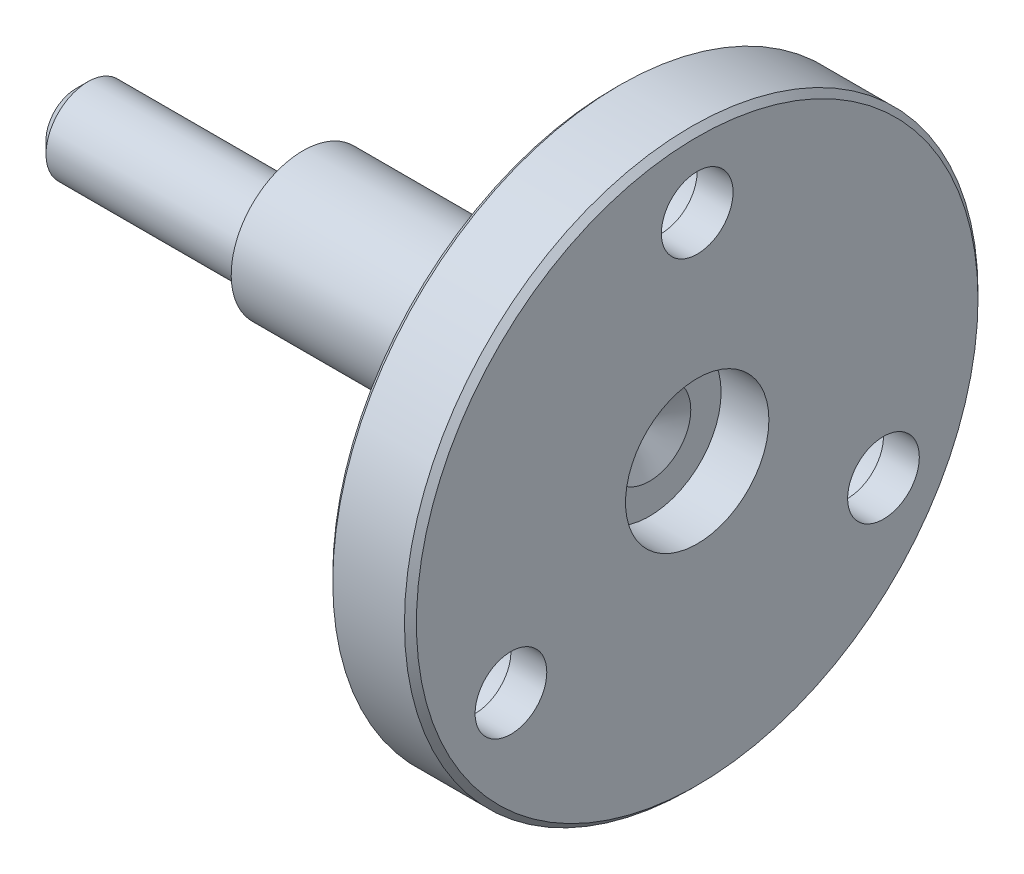
ISO-10303-21;
HEADER;
FILE_DESCRIPTION(('STEP AP214'),'2;1');
FILE_NAME('part.step','',(''),(''),'','','');
FILE_SCHEMA(('AUTOMOTIVE_DESIGN { 1 0 10303 214 1 1 1 1 }'));
ENDSEC;
DATA;
#1=APPLICATION_CONTEXT('core data for automotive mechanical design processes');
#2=APPLICATION_PROTOCOL_DEFINITION('international standard','automotive_design',2000,#1);
#3=PRODUCT_CONTEXT('',#1,'mechanical');
#4=PRODUCT('Part','Part','',(#3));
#5=PRODUCT_RELATED_PRODUCT_CATEGORY('part','',(#4));
#6=PRODUCT_DEFINITION_FORMATION('','',#4);
#7=PRODUCT_DEFINITION_CONTEXT('part definition',#1,'design');
#8=PRODUCT_DEFINITION('design','',#6,#7);
#9=PRODUCT_DEFINITION_SHAPE('','',#8);
#10=(LENGTH_UNIT() NAMED_UNIT(*) SI_UNIT(.MILLI.,.METRE.));
#11=(NAMED_UNIT(*) PLANE_ANGLE_UNIT() SI_UNIT($,.RADIAN.));
#12=(NAMED_UNIT(*) SI_UNIT($,.STERADIAN.) SOLID_ANGLE_UNIT());
#13=UNCERTAINTY_MEASURE_WITH_UNIT(LENGTH_MEASURE(1.E-05),#10,'distance_accuracy_value','');
#14=(GEOMETRIC_REPRESENTATION_CONTEXT(3) GLOBAL_UNCERTAINTY_ASSIGNED_CONTEXT((#13)) GLOBAL_UNIT_ASSIGNED_CONTEXT((#10,
#11,#12)) REPRESENTATION_CONTEXT('',''));
#15=CARTESIAN_POINT('',(0.,0.,0.));
#16=DIRECTION('',(0.,0.,1.));
#17=DIRECTION('',(1.,0.,0.));
#18=AXIS2_PLACEMENT_3D('',#15,#16,#17);
#19=CARTESIAN_POINT('',(-7.,11.,0.));
#20=DIRECTION('',(-1.,0.,0.));
#21=DIRECTION('',(0.,0.,1.));
#22=AXIS2_PLACEMENT_3D('',#19,#20,#21);
#23=PLANE('',#22);
#24=CARTESIAN_POINT('',(-7.,-9.00000000000008,-15.5884572681199));
#25=DIRECTION('',(-1.,0.,0.));
#26=DIRECTION('',(0.,0.,1.));
#27=AXIS2_PLACEMENT_3D('',#24,#25,#26);
#28=CIRCLE('',#27,5.00000000000001);
#29=CARTESIAN_POINT('',(-7.,-9.00000000000008,-10.5884572681198));
#30=VERTEX_POINT('',#29);
#31=EDGE_CURVE('E84',#30,#30,#28,.F.);
#32=ORIENTED_EDGE('',*,*,#31,.T.);
#33=EDGE_LOOP('',(#32));
#34=FACE_BOUND('',#33,.T.);
#35=CARTESIAN_POINT('',(-7.,0.,0.));
#36=DIRECTION('',(1.,0.,0.));
#37=DIRECTION('',(0.,0.,-1.));
#38=AXIS2_PLACEMENT_3D('',#35,#36,#37);
#39=CIRCLE('',#38,11.);
#40=CARTESIAN_POINT('',(-7.,0.,-11.));
#41=VERTEX_POINT('',#40);
#42=EDGE_CURVE('E129',#41,#41,#39,.T.);
#43=ORIENTED_EDGE('',*,*,#42,.T.);
#44=EDGE_LOOP('',(#43));
#45=FACE_BOUND('',#44,.T.);
#46=CARTESIAN_POINT('',(-7.,0.,0.));
#47=DIRECTION('',(-1.,0.,0.));
#48=DIRECTION('',(0.,0.,1.));
#49=AXIS2_PLACEMENT_3D('',#46,#47,#48);
#50=CIRCLE('',#49,23.5);
#51=CARTESIAN_POINT('',(-7.,0.,23.5));
#52=VERTEX_POINT('',#51);
#53=EDGE_CURVE('E45',#52,#52,#50,.T.);
#54=ORIENTED_EDGE('',*,*,#53,.T.);
#55=EDGE_LOOP('',(#54));
#56=FACE_BOUND('',#55,.T.);
#57=CARTESIAN_POINT('',(-7.,18.,0.));
#58=DIRECTION('',(-1.,0.,0.));
#59=DIRECTION('',(0.,0.,1.));
#60=AXIS2_PLACEMENT_3D('',#57,#58,#59);
#61=CIRCLE('',#60,5.00000000000001);
#62=CARTESIAN_POINT('',(-7.,18.,5.00000000000001));
#63=VERTEX_POINT('',#62);
#64=EDGE_CURVE('E76',#63,#63,#61,.F.);
#65=ORIENTED_EDGE('',*,*,#64,.T.);
#66=EDGE_LOOP('',(#65));
#67=FACE_BOUND('',#66,.T.);
#68=CARTESIAN_POINT('',(-7.,-8.99999999999986,15.58845726812));
#69=DIRECTION('',(-1.,0.,0.));
#70=DIRECTION('',(0.,0.,1.));
#71=AXIS2_PLACEMENT_3D('',#68,#69,#70);
#72=CIRCLE('',#71,5.00000000000001);
#73=CARTESIAN_POINT('',(-7.,-8.99999999999986,20.58845726812));
#74=VERTEX_POINT('',#73);
#75=EDGE_CURVE('E40',#74,#74,#72,.F.);
#76=ORIENTED_EDGE('',*,*,#75,.T.);
#77=EDGE_LOOP('',(#76));
#78=FACE_BOUND('',#77,.T.);
#79=ADVANCED_FACE('F36',(#34,#45,#56,#67,#78),#23,.T.);
#80=CARTESIAN_POINT('',(0.,24.,0.));
#81=DIRECTION('',(1.,0.,0.));
#82=DIRECTION('',(0.,0.,-1.));
#83=AXIS2_PLACEMENT_3D('',#80,#81,#82);
#84=PLANE('',#83);
#85=CARTESIAN_POINT('',(0.,-9.00000000000007,-15.5884572681199));
#86=DIRECTION('',(1.,0.,0.));
#87=DIRECTION('',(0.,0.,-1.));
#88=AXIS2_PLACEMENT_3D('',#85,#86,#87);
#89=CIRCLE('',#88,3.);
#90=CARTESIAN_POINT('',(0.,-9.00000000000007,-18.5884572681199));
#91=VERTEX_POINT('',#90);
#92=EDGE_CURVE('E81',#91,#91,#89,.F.);
#93=ORIENTED_EDGE('',*,*,#92,.T.);
#94=EDGE_LOOP('',(#93));
#95=FACE_BOUND('',#94,.T.);
#96=CARTESIAN_POINT('',(0.,0.,0.));
#97=DIRECTION('',(1.,0.,0.));
#98=DIRECTION('',(0.,0.,-1.));
#99=AXIS2_PLACEMENT_3D('',#96,#97,#98);
#100=CIRCLE('',#99,6.);
#101=CARTESIAN_POINT('',(0.,0.,-6.));
#102=VERTEX_POINT('',#101);
#103=EDGE_CURVE('E126',#102,#102,#100,.T.);
#104=ORIENTED_EDGE('',*,*,#103,.F.);
#105=EDGE_LOOP('',(#104));
#106=FACE_BOUND('',#105,.T.);
#107=CARTESIAN_POINT('',(0.,0.,0.));
#108=DIRECTION('',(1.,0.,0.));
#109=DIRECTION('',(0.,0.,-1.));
#110=AXIS2_PLACEMENT_3D('',#107,#108,#109);
#111=CIRCLE('',#110,23.5);
#112=CARTESIAN_POINT('',(0.,0.,-23.5));
#113=VERTEX_POINT('',#112);
#114=EDGE_CURVE('E12',#113,#113,#111,.T.);
#115=ORIENTED_EDGE('',*,*,#114,.T.);
#116=EDGE_LOOP('',(#115));
#117=FACE_BOUND('',#116,.T.);
#118=CARTESIAN_POINT('',(0.,18.,0.));
#119=DIRECTION('',(1.,0.,0.));
#120=DIRECTION('',(0.,0.,-1.));
#121=AXIS2_PLACEMENT_3D('',#118,#119,#120);
#122=CIRCLE('',#121,3.);
#123=CARTESIAN_POINT('',(0.,18.,-3.));
#124=VERTEX_POINT('',#123);
#125=EDGE_CURVE('E73',#124,#124,#122,.F.);
#126=ORIENTED_EDGE('',*,*,#125,.T.);
#127=EDGE_LOOP('',(#126));
#128=FACE_BOUND('',#127,.T.);
#129=CARTESIAN_POINT('',(0.,-8.99999999999985,15.58845726812));
#130=DIRECTION('',(1.,0.,0.));
#131=DIRECTION('',(0.,0.,-1.));
#132=AXIS2_PLACEMENT_3D('',#129,#130,#131);
#133=CIRCLE('',#132,3.);
#134=CARTESIAN_POINT('',(0.,-8.99999999999985,12.58845726812));
#135=VERTEX_POINT('',#134);
#136=EDGE_CURVE('E88',#135,#135,#133,.F.);
#137=ORIENTED_EDGE('',*,*,#136,.T.);
#138=EDGE_LOOP('',(#137));
#139=FACE_BOUND('',#138,.T.);
#140=ADVANCED_FACE('F152',(#95,#106,#117,#128,#139),#84,.T.);
#141=CARTESIAN_POINT('',(-33.,0.,0.));
#142=DIRECTION('',(-1.,0.,0.));
#143=DIRECTION('',(0.,0.,1.));
#144=AXIS2_PLACEMENT_3D('',#141,#142,#143);
#145=PLANE('',#144);
#146=CARTESIAN_POINT('',(-33.,0.,0.));
#147=DIRECTION('',(1.,0.,0.));
#148=DIRECTION('',(0.,0.,-1.));
#149=AXIS2_PLACEMENT_3D('',#146,#147,#148);
#150=CIRCLE('',#149,5.99999999999999);
#151=CARTESIAN_POINT('',(-33.,-6.00000000000005,0.));
#152=VERTEX_POINT('',#151);
#153=EDGE_CURVE('E54',#152,#152,#150,.T.);
#154=ORIENTED_EDGE('',*,*,#153,.F.);
#155=CARTESIAN_POINT('',(-33.,-1.5,0.));
#156=DIRECTION('',(1.,0.,0.));
#157=DIRECTION('',(0.,1.,0.));
#158=AXIS2_PLACEMENT_3D('',#155,#156,#157);
#159=CIRCLE('',#158,4.50000000000004);
#160=EDGE_CURVE('E56',#152,#152,#159,.T.);
#161=ORIENTED_EDGE('',*,*,#160,.T.);
#162=EDGE_LOOP('',(#154,#161));
#163=FACE_BOUND('',#162,.T.);
#164=ADVANCED_FACE('F38',(#163),#145,.T.);
#165=CARTESIAN_POINT('',(0.,0.,0.));
#166=DIRECTION('',(1.,0.,0.));
#167=DIRECTION('',(0.,0.,-1.));
#168=AXIS2_PLACEMENT_3D('',#165,#166,#167);
#169=CYLINDRICAL_SURFACE('',#168,5.99999999999999);
#170=ORIENTED_EDGE('',*,*,#153,.T.);
#171=EDGE_LOOP('',(#170));
#172=FACE_BOUND('',#171,.T.);
#173=CARTESIAN_POINT('',(-11.,0.,0.));
#174=DIRECTION('',(1.,0.,0.));
#175=DIRECTION('',(0.,0.,-1.));
#176=AXIS2_PLACEMENT_3D('',#173,#174,#175);
#177=CIRCLE('',#176,5.99999999999999);
#178=CARTESIAN_POINT('',(-11.,0.,-5.99999999999999));
#179=VERTEX_POINT('',#178);
#180=EDGE_CURVE('E59',#179,#179,#177,.T.);
#181=ORIENTED_EDGE('',*,*,#180,.F.);
#182=EDGE_LOOP('',(#181));
#183=FACE_BOUND('',#182,.T.);
#184=ADVANCED_FACE('F142',(#172,#183),#169,.T.);
#185=CARTESIAN_POINT('',(-11.,5.99999999999999,0.));
#186=DIRECTION('',(-1.,0.,0.));
#187=DIRECTION('',(0.,0.,1.));
#188=AXIS2_PLACEMENT_3D('',#185,#186,#187);
#189=PLANE('',#188);
#190=ORIENTED_EDGE('',*,*,#180,.T.);
#191=EDGE_LOOP('',(#190));
#192=FACE_BOUND('',#191,.T.);
#193=CARTESIAN_POINT('',(-11.,0.,0.));
#194=DIRECTION('',(1.,0.,0.));
#195=DIRECTION('',(0.,0.,-1.));
#196=AXIS2_PLACEMENT_3D('',#193,#194,#195);
#197=CIRCLE('',#196,8.);
#198=CARTESIAN_POINT('',(-11.,0.,-8.));
#199=VERTEX_POINT('',#198);
#200=EDGE_CURVE('E65',#199,#199,#197,.T.);
#201=ORIENTED_EDGE('',*,*,#200,.F.);
#202=EDGE_LOOP('',(#201));
#203=FACE_BOUND('',#202,.T.);
#204=ADVANCED_FACE('F140',(#192,#203),#189,.T.);
#205=CARTESIAN_POINT('',(0.,0.,0.));
#206=DIRECTION('',(1.,0.,0.));
#207=DIRECTION('',(0.,0.,-1.));
#208=AXIS2_PLACEMENT_3D('',#205,#206,#207);
#209=CYLINDRICAL_SURFACE('',#208,8.);
#210=ORIENTED_EDGE('',*,*,#200,.T.);
#211=EDGE_LOOP('',(#210));
#212=FACE_BOUND('',#211,.T.);
#213=CARTESIAN_POINT('',(-10.,0.,0.));
#214=DIRECTION('',(1.,0.,0.));
#215=DIRECTION('',(0.,0.,-1.));
#216=AXIS2_PLACEMENT_3D('',#213,#214,#215);
#217=CIRCLE('',#216,8.);
#218=CARTESIAN_POINT('',(-10.,0.,-8.));
#219=VERTEX_POINT('',#218);
#220=EDGE_CURVE('E132',#219,#219,#217,.T.);
#221=ORIENTED_EDGE('',*,*,#220,.F.);
#222=EDGE_LOOP('',(#221));
#223=FACE_BOUND('',#222,.T.);
#224=ADVANCED_FACE('F137',(#212,#223),#209,.T.);
#225=CARTESIAN_POINT('',(-10.,0.,0.));
#226=DIRECTION('',(1.,0.,0.));
#227=DIRECTION('',(0.,0.,-1.));
#228=AXIS2_PLACEMENT_3D('',#225,#226,#227);
#229=TOROIDAL_SURFACE('',#228,11.,3.);
#230=ORIENTED_EDGE('',*,*,#220,.T.);
#231=EDGE_LOOP('',(#230));
#232=FACE_BOUND('',#231,.T.);
#233=ORIENTED_EDGE('',*,*,#42,.F.);
#234=EDGE_LOOP('',(#233));
#235=FACE_BOUND('',#234,.T.);
#236=ADVANCED_FACE('F149',(#232,#235),#229,.F.);
#237=CARTESIAN_POINT('',(0.,0.,0.));
#238=DIRECTION('',(1.,0.,0.));
#239=DIRECTION('',(0.,0.,-1.));
#240=AXIS2_PLACEMENT_3D('',#237,#238,#239);
#241=CYLINDRICAL_SURFACE('',#240,24.);
#242=CARTESIAN_POINT('',(-6.5,0.,0.));
#243=DIRECTION('',(-1.,0.,0.));
#244=DIRECTION('',(0.,0.,1.));
#245=AXIS2_PLACEMENT_3D('',#242,#243,#244);
#246=CIRCLE('',#245,24.);
#247=CARTESIAN_POINT('',(-6.5,0.,24.));
#248=VERTEX_POINT('',#247);
#249=EDGE_CURVE('E62',#248,#248,#246,.F.);
#250=ORIENTED_EDGE('',*,*,#249,.T.);
#251=EDGE_LOOP('',(#250));
#252=FACE_BOUND('',#251,.T.);
#253=CARTESIAN_POINT('',(-0.5,0.,0.));
#254=DIRECTION('',(1.,0.,0.));
#255=DIRECTION('',(0.,0.,-1.));
#256=AXIS2_PLACEMENT_3D('',#253,#254,#255);
#257=CIRCLE('',#256,24.);
#258=CARTESIAN_POINT('',(-0.5,0.,-24.));
#259=VERTEX_POINT('',#258);
#260=EDGE_CURVE('E58',#259,#259,#257,.F.);
#261=ORIENTED_EDGE('',*,*,#260,.T.);
#262=EDGE_LOOP('',(#261));
#263=FACE_BOUND('',#262,.T.);
#264=ADVANCED_FACE('F163',(#252,#263),#241,.T.);
#265=CARTESIAN_POINT('',(0.,0.,0.));
#266=DIRECTION('',(1.,0.,0.));
#267=DIRECTION('',(0.,0.,-1.));
#268=AXIS2_PLACEMENT_3D('',#265,#266,#267);
#269=CYLINDRICAL_SURFACE('',#268,6.);
#270=ORIENTED_EDGE('',*,*,#103,.T.);
#271=EDGE_LOOP('',(#270));
#272=FACE_BOUND('',#271,.T.);
#273=CARTESIAN_POINT('',(-4.,0.,0.));
#274=DIRECTION('',(1.,0.,0.));
#275=DIRECTION('',(0.,0.,-1.));
#276=AXIS2_PLACEMENT_3D('',#273,#274,#275);
#277=CIRCLE('',#276,6.);
#278=CARTESIAN_POINT('',(-4.,0.,-6.));
#279=VERTEX_POINT('',#278);
#280=EDGE_CURVE('E123',#279,#279,#277,.T.);
#281=ORIENTED_EDGE('',*,*,#280,.F.);
#282=EDGE_LOOP('',(#281));
#283=FACE_BOUND('',#282,.T.);
#284=ADVANCED_FACE('F169',(#272,#283),#269,.F.);
#285=CARTESIAN_POINT('',(-4.,6.,0.));
#286=DIRECTION('',(1.,0.,0.));
#287=DIRECTION('',(0.,0.,-1.));
#288=AXIS2_PLACEMENT_3D('',#285,#286,#287);
#289=PLANE('',#288);
#290=ORIENTED_EDGE('',*,*,#280,.T.);
#291=EDGE_LOOP('',(#290));
#292=FACE_BOUND('',#291,.T.);
#293=CARTESIAN_POINT('',(-4.,0.,0.));
#294=DIRECTION('',(1.,0.,0.));
#295=DIRECTION('',(0.,0.,-1.));
#296=AXIS2_PLACEMENT_3D('',#293,#294,#295);
#297=CIRCLE('',#296,3.46410161513778);
#298=CARTESIAN_POINT('',(-4.,0.,-3.46410161513778));
#299=VERTEX_POINT('',#298);
#300=EDGE_CURVE('E120',#299,#299,#297,.T.);
#301=ORIENTED_EDGE('',*,*,#300,.F.);
#302=EDGE_LOOP('',(#301));
#303=FACE_BOUND('',#302,.T.);
#304=ADVANCED_FACE('F244',(#292,#303),#289,.T.);
#305=CARTESIAN_POINT('',(-6.,0.,0.));
#306=DIRECTION('',(1.,0.,0.));
#307=DIRECTION('',(0.,0.,-1.));
#308=AXIS2_PLACEMENT_3D('',#305,#306,#307);
#309=CONICAL_SURFACE('',#308,0.,1.0471975511966);
#310=ORIENTED_EDGE('',*,*,#300,.T.);
#311=EDGE_LOOP('',(#310));
#312=FACE_BOUND('',#311,.T.);
#313=CARTESIAN_POINT('',(-6.,0.,0.));
#314=VERTEX_POINT('',#313);
#315=VERTEX_LOOP('',#314);
#316=FACE_BOUND('',#315,.T.);
#317=ADVANCED_FACE('F240',(#312,#316),#309,.F.);
#318=CARTESIAN_POINT('',(-6.5,0.,0.));
#319=DIRECTION('',(1.,0.,0.));
#320=DIRECTION('',(0.,0.,-1.));
#321=AXIS2_PLACEMENT_3D('',#318,#319,#320);
#322=CONICAL_SURFACE('',#321,24.,0.785398163397452);
#323=ORIENTED_EDGE('',*,*,#53,.F.);
#324=EDGE_LOOP('',(#323));
#325=FACE_BOUND('',#324,.T.);
#326=ORIENTED_EDGE('',*,*,#249,.F.);
#327=EDGE_LOOP('',(#326));
#328=FACE_BOUND('',#327,.T.);
#329=ADVANCED_FACE('F236',(#325,#328),#322,.T.);
#330=CARTESIAN_POINT('',(0.,0.,0.));
#331=DIRECTION('',(-1.,0.,0.));
#332=DIRECTION('',(0.,0.,1.));
#333=AXIS2_PLACEMENT_3D('',#330,#331,#332);
#334=CONICAL_SURFACE('',#333,23.5,0.785398163397452);
#335=ORIENTED_EDGE('',*,*,#260,.F.);
#336=EDGE_LOOP('',(#335));
#337=FACE_BOUND('',#336,.T.);
#338=ORIENTED_EDGE('',*,*,#114,.F.);
#339=EDGE_LOOP('',(#338));
#340=FACE_BOUND('',#339,.T.);
#341=ADVANCED_FACE('F232',(#337,#340),#334,.T.);
#342=CARTESIAN_POINT('',(-33.,-1.5,0.));
#343=DIRECTION('',(1.,0.,0.));
#344=DIRECTION('',(0.,1.,0.));
#345=AXIS2_PLACEMENT_3D('',#342,#343,#344);
#346=CONICAL_SURFACE('',#345,4.50000000000004,0.785398163397451);
#347=CARTESIAN_POINT('',(-34.,-1.5,0.));
#348=DIRECTION('',(1.,0.,0.));
#349=DIRECTION('',(0.,1.,0.));
#350=AXIS2_PLACEMENT_3D('',#347,#348,#349);
#351=CIRCLE('',#350,3.5);
#352=CARTESIAN_POINT('',(-34.,2.,0.));
#353=VERTEX_POINT('',#352);
#354=EDGE_CURVE('E116',#353,#353,#351,.T.);
#355=ORIENTED_EDGE('',*,*,#354,.T.);
#356=EDGE_LOOP('',(#355));
#357=FACE_BOUND('',#356,.T.);
#358=ORIENTED_EDGE('',*,*,#160,.F.);
#359=EDGE_LOOP('',(#358));
#360=FACE_BOUND('',#359,.T.);
#361=ADVANCED_FACE('F228',(#357,#360),#346,.T.);
#362=CARTESIAN_POINT('',(-19.,-1.5,0.));
#363=DIRECTION('',(1.,0.,0.));
#364=DIRECTION('',(0.,1.,0.));
#365=AXIS2_PLACEMENT_3D('',#362,#363,#364);
#366=CYLINDRICAL_SURFACE('',#365,3.5);
#367=CARTESIAN_POINT('',(-51.,-1.50000000000001,0.));
#368=DIRECTION('',(1.,0.,0.));
#369=DIRECTION('',(0.,1.,0.));
#370=AXIS2_PLACEMENT_3D('',#367,#368,#369);
#371=CIRCLE('',#370,3.5);
#372=CARTESIAN_POINT('',(-51.,1.99999999999999,0.));
#373=VERTEX_POINT('',#372);
#374=EDGE_CURVE('E113',#373,#373,#371,.T.);
#375=ORIENTED_EDGE('',*,*,#374,.T.);
#376=EDGE_LOOP('',(#375));
#377=FACE_BOUND('',#376,.T.);
#378=ORIENTED_EDGE('',*,*,#354,.F.);
#379=EDGE_LOOP('',(#378));
#380=FACE_BOUND('',#379,.T.);
#381=ADVANCED_FACE('F224',(#377,#380),#366,.T.);
#382=CARTESIAN_POINT('',(-51.,-1.50000000000001,0.));
#383=DIRECTION('',(1.,0.,0.));
#384=DIRECTION('',(0.,1.,0.));
#385=AXIS2_PLACEMENT_3D('',#382,#383,#384);
#386=CONICAL_SURFACE('',#385,3.5,0.785398163397449);
#387=CARTESIAN_POINT('',(-52.,-1.50000000000001,0.));
#388=DIRECTION('',(1.,0.,0.));
#389=DIRECTION('',(0.,1.,0.));
#390=AXIS2_PLACEMENT_3D('',#387,#388,#389);
#391=CIRCLE('',#390,2.5);
#392=CARTESIAN_POINT('',(-52.,0.999999999999992,0.));
#393=VERTEX_POINT('',#392);
#394=EDGE_CURVE('E80',#393,#393,#391,.T.);
#395=ORIENTED_EDGE('',*,*,#394,.T.);
#396=EDGE_LOOP('',(#395));
#397=FACE_BOUND('',#396,.T.);
#398=ORIENTED_EDGE('',*,*,#374,.F.);
#399=EDGE_LOOP('',(#398));
#400=FACE_BOUND('',#399,.T.);
#401=ADVANCED_FACE('F220',(#397,#400),#386,.T.);
#402=CARTESIAN_POINT('',(-52.,0.999999999999992,0.));
#403=DIRECTION('',(-1.,0.,0.));
#404=DIRECTION('',(0.,-1.,0.));
#405=AXIS2_PLACEMENT_3D('',#402,#403,#404);
#406=PLANE('',#405);
#407=ORIENTED_EDGE('',*,*,#394,.F.);
#408=EDGE_LOOP('',(#407));
#409=FACE_BOUND('',#408,.T.);
#410=ADVANCED_FACE('F216',(#409),#406,.T.);
#411=CARTESIAN_POINT('',(-12.,18.,0.));
#412=DIRECTION('',(-1.,0.,0.));
#413=DIRECTION('',(0.,0.,1.));
#414=AXIS2_PLACEMENT_3D('',#411,#412,#413);
#415=CYLINDRICAL_SURFACE('',#414,5.00000000000001);
#416=ORIENTED_EDGE('',*,*,#64,.F.);
#417=EDGE_LOOP('',(#416));
#418=FACE_BOUND('',#417,.T.);
#419=CARTESIAN_POINT('',(-3.,18.,0.));
#420=DIRECTION('',(-1.,0.,0.));
#421=DIRECTION('',(0.,0.,1.));
#422=AXIS2_PLACEMENT_3D('',#419,#420,#421);
#423=CIRCLE('',#422,5.00000000000001);
#424=CARTESIAN_POINT('',(-3.,18.,5.00000000000001));
#425=VERTEX_POINT('',#424);
#426=EDGE_CURVE('E77',#425,#425,#423,.T.);
#427=ORIENTED_EDGE('',*,*,#426,.F.);
#428=EDGE_LOOP('',(#427));
#429=FACE_BOUND('',#428,.T.);
#430=ADVANCED_FACE('F212',(#418,#429),#415,.F.);
#431=CARTESIAN_POINT('',(-3.,23.,0.));
#432=DIRECTION('',(-1.,0.,0.));
#433=DIRECTION('',(0.,0.,1.));
#434=AXIS2_PLACEMENT_3D('',#431,#432,#433);
#435=PLANE('',#434);
#436=ORIENTED_EDGE('',*,*,#426,.T.);
#437=EDGE_LOOP('',(#436));
#438=FACE_BOUND('',#437,.T.);
#439=CARTESIAN_POINT('',(-3.,18.,0.));
#440=DIRECTION('',(-1.,0.,0.));
#441=DIRECTION('',(0.,0.,1.));
#442=AXIS2_PLACEMENT_3D('',#439,#440,#441);
#443=CIRCLE('',#442,3.);
#444=CARTESIAN_POINT('',(-3.,18.,3.));
#445=VERTEX_POINT('',#444);
#446=EDGE_CURVE('E87',#445,#445,#443,.T.);
#447=ORIENTED_EDGE('',*,*,#446,.F.);
#448=EDGE_LOOP('',(#447));
#449=FACE_BOUND('',#448,.T.);
#450=ADVANCED_FACE('F208',(#438,#449),#435,.T.);
#451=CARTESIAN_POINT('',(-12.,18.,0.));
#452=DIRECTION('',(-1.,0.,0.));
#453=DIRECTION('',(0.,0.,1.));
#454=AXIS2_PLACEMENT_3D('',#451,#452,#453);
#455=CYLINDRICAL_SURFACE('',#454,3.);
#456=ORIENTED_EDGE('',*,*,#125,.F.);
#457=EDGE_LOOP('',(#456));
#458=FACE_BOUND('',#457,.T.);
#459=ORIENTED_EDGE('',*,*,#446,.T.);
#460=EDGE_LOOP('',(#459));
#461=FACE_BOUND('',#460,.T.);
#462=ADVANCED_FACE('F204',(#458,#461),#455,.F.);
#463=CARTESIAN_POINT('',(-12.,-9.00000000000008,-15.5884572681199));
#464=DIRECTION('',(-1.,0.,0.));
#465=DIRECTION('',(0.,0.866025403784436,-0.500000000000004));
#466=AXIS2_PLACEMENT_3D('',#463,#464,#465);
#467=CYLINDRICAL_SURFACE('',#466,5.00000000000001);
#468=ORIENTED_EDGE('',*,*,#31,.F.);
#469=EDGE_LOOP('',(#468));
#470=FACE_BOUND('',#469,.T.);
#471=CARTESIAN_POINT('',(-3.,-9.00000000000008,-15.5884572681199));
#472=DIRECTION('',(-1.,0.,0.));
#473=DIRECTION('',(0.,0.866025403784436,-0.500000000000004));
#474=AXIS2_PLACEMENT_3D('',#471,#472,#473);
#475=CIRCLE('',#474,5.00000000000001);
#476=CARTESIAN_POINT('',(-3.,-4.66987298107789,-18.0884572681199));
#477=VERTEX_POINT('',#476);
#478=EDGE_CURVE('E85',#477,#477,#475,.T.);
#479=ORIENTED_EDGE('',*,*,#478,.F.);
#480=EDGE_LOOP('',(#479));
#481=FACE_BOUND('',#480,.T.);
#482=ADVANCED_FACE('F200',(#470,#481),#467,.F.);
#483=CARTESIAN_POINT('',(-3.,-11.5000000000001,-19.918584287042));
#484=DIRECTION('',(-1.,0.,0.));
#485=DIRECTION('',(0.,0.866025403784436,-0.500000000000004));
#486=AXIS2_PLACEMENT_3D('',#483,#484,#485);
#487=PLANE('',#486);
#488=ORIENTED_EDGE('',*,*,#478,.T.);
#489=EDGE_LOOP('',(#488));
#490=FACE_BOUND('',#489,.T.);
#491=CARTESIAN_POINT('',(-3.,-9.00000000000008,-15.5884572681199));
#492=DIRECTION('',(-1.,0.,0.));
#493=DIRECTION('',(0.,0.866025403784436,-0.500000000000004));
#494=AXIS2_PLACEMENT_3D('',#491,#492,#493);
#495=CIRCLE('',#494,3.);
#496=CARTESIAN_POINT('',(-3.,-6.40192378864677,-17.0884572681199));
#497=VERTEX_POINT('',#496);
#498=EDGE_CURVE('E94',#497,#497,#495,.T.);
#499=ORIENTED_EDGE('',*,*,#498,.F.);
#500=EDGE_LOOP('',(#499));
#501=FACE_BOUND('',#500,.T.);
#502=ADVANCED_FACE('F193',(#490,#501),#487,.T.);
#503=CARTESIAN_POINT('',(-12.,-9.00000000000008,-15.5884572681199));
#504=DIRECTION('',(-1.,0.,0.));
#505=DIRECTION('',(0.,0.866025403784436,-0.500000000000004));
#506=AXIS2_PLACEMENT_3D('',#503,#504,#505);
#507=CYLINDRICAL_SURFACE('',#506,3.);
#508=ORIENTED_EDGE('',*,*,#92,.F.);
#509=EDGE_LOOP('',(#508));
#510=FACE_BOUND('',#509,.T.);
#511=ORIENTED_EDGE('',*,*,#498,.T.);
#512=EDGE_LOOP('',(#511));
#513=FACE_BOUND('',#512,.T.);
#514=ADVANCED_FACE('F185',(#510,#513),#507,.F.);
#515=CARTESIAN_POINT('',(-12.,-8.99999999999986,15.58845726812));
#516=DIRECTION('',(-1.,0.,0.));
#517=DIRECTION('',(0.,-0.866025403784443,-0.499999999999992));
#518=AXIS2_PLACEMENT_3D('',#515,#516,#517);
#519=CYLINDRICAL_SURFACE('',#518,5.00000000000001);
#520=ORIENTED_EDGE('',*,*,#75,.F.);
#521=EDGE_LOOP('',(#520));
#522=FACE_BOUND('',#521,.T.);
#523=CARTESIAN_POINT('',(-3.,-8.99999999999986,15.58845726812));
#524=DIRECTION('',(-1.,0.,0.));
#525=DIRECTION('',(0.,-0.866025403784443,-0.499999999999992));
#526=AXIS2_PLACEMENT_3D('',#523,#524,#525);
#527=CIRCLE('',#526,5.00000000000001);
#528=CARTESIAN_POINT('',(-3.,-13.3301270189221,13.08845726812));
#529=VERTEX_POINT('',#528);
#530=EDGE_CURVE('E90',#529,#529,#527,.T.);
#531=ORIENTED_EDGE('',*,*,#530,.F.);
#532=EDGE_LOOP('',(#531));
#533=FACE_BOUND('',#532,.T.);
#534=ADVANCED_FACE('F181',(#522,#533),#519,.F.);
#535=CARTESIAN_POINT('',(-3.,-11.4999999999998,19.9185842870422));
#536=DIRECTION('',(-1.,0.,0.));
#537=DIRECTION('',(0.,-0.866025403784443,-0.499999999999992));
#538=AXIS2_PLACEMENT_3D('',#535,#536,#537);
#539=PLANE('',#538);
#540=ORIENTED_EDGE('',*,*,#530,.T.);
#541=EDGE_LOOP('',(#540));
#542=FACE_BOUND('',#541,.T.);
#543=CARTESIAN_POINT('',(-3.,-8.99999999999986,15.58845726812));
#544=DIRECTION('',(-1.,0.,0.));
#545=DIRECTION('',(0.,-0.866025403784443,-0.499999999999992));
#546=AXIS2_PLACEMENT_3D('',#543,#544,#545);
#547=CIRCLE('',#546,3.);
#548=CARTESIAN_POINT('',(-3.,-11.5980762113532,14.08845726812));
#549=VERTEX_POINT('',#548);
#550=EDGE_CURVE('E96',#549,#549,#547,.T.);
#551=ORIENTED_EDGE('',*,*,#550,.F.);
#552=EDGE_LOOP('',(#551));
#553=FACE_BOUND('',#552,.T.);
#554=ADVANCED_FACE('F184',(#542,#553),#539,.T.);
#555=CARTESIAN_POINT('',(-12.,-8.99999999999986,15.58845726812));
#556=DIRECTION('',(-1.,0.,0.));
#557=DIRECTION('',(0.,-0.866025403784443,-0.499999999999992));
#558=AXIS2_PLACEMENT_3D('',#555,#556,#557);
#559=CYLINDRICAL_SURFACE('',#558,3.);
#560=ORIENTED_EDGE('',*,*,#136,.F.);
#561=EDGE_LOOP('',(#560));
#562=FACE_BOUND('',#561,.T.);
#563=ORIENTED_EDGE('',*,*,#550,.T.);
#564=EDGE_LOOP('',(#563));
#565=FACE_BOUND('',#564,.T.);
#566=ADVANCED_FACE('F191',(#562,#565),#559,.F.);
#567=CLOSED_SHELL('',(#79,#140,#164,#184,#204,#224,#236,#264,#284,#304,#317,#329,#341,#361,#381,
#401,#410,#430,#450,#462,#482,#502,#514,#534,#554,#566));
#568=MANIFOLD_SOLID_BREP('B2',#567);
#569=ADVANCED_BREP_SHAPE_REPRESENTATION('',(#18,#568),#14);
#570=SHAPE_DEFINITION_REPRESENTATION(#9,#569);
ENDSEC;
END-ISO-10303-21;
